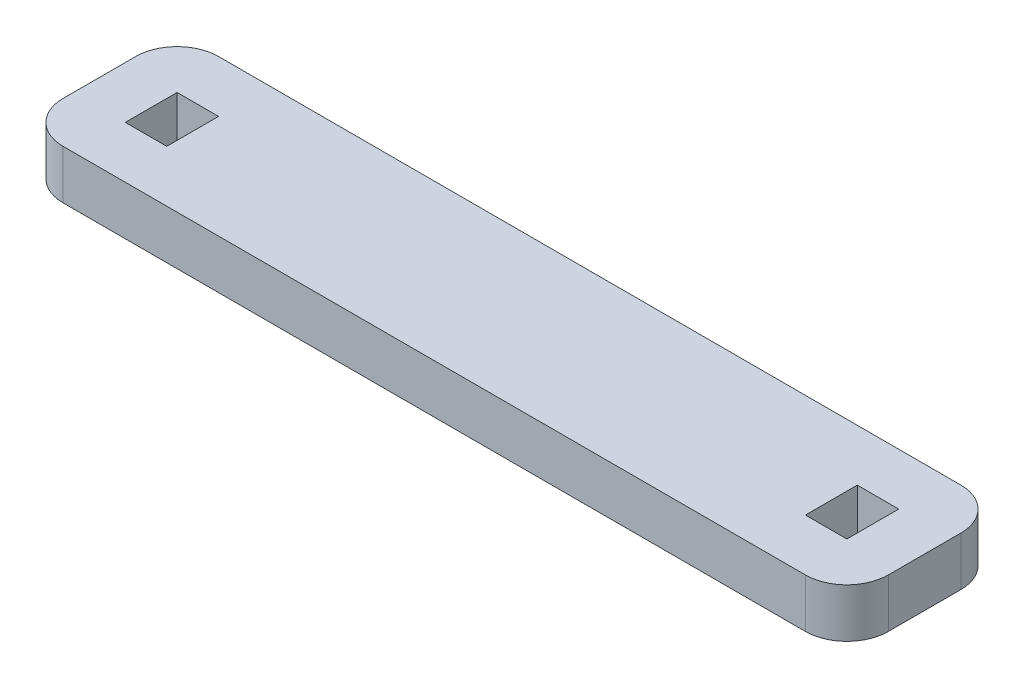
ISO-10303-21;
HEADER;
FILE_DESCRIPTION(('STEP AP214'),'2;1');
FILE_NAME('part.step','',(''),(''),'','','');
FILE_SCHEMA(('AUTOMOTIVE_DESIGN { 1 0 10303 214 1 1 1 1 }'));
ENDSEC;
DATA;
#1=APPLICATION_CONTEXT('core data for automotive mechanical design processes');
#2=APPLICATION_PROTOCOL_DEFINITION('international standard','automotive_design',2000,#1);
#3=PRODUCT_CONTEXT('',#1,'mechanical');
#4=PRODUCT('Part','Part','',(#3));
#5=PRODUCT_RELATED_PRODUCT_CATEGORY('part','',(#4));
#6=PRODUCT_DEFINITION_FORMATION('','',#4);
#7=PRODUCT_DEFINITION_CONTEXT('part definition',#1,'design');
#8=PRODUCT_DEFINITION('design','',#6,#7);
#9=PRODUCT_DEFINITION_SHAPE('','',#8);
#10=(LENGTH_UNIT() NAMED_UNIT(*) SI_UNIT(.MILLI.,.METRE.));
#11=(NAMED_UNIT(*) PLANE_ANGLE_UNIT() SI_UNIT($,.RADIAN.));
#12=(NAMED_UNIT(*) SI_UNIT($,.STERADIAN.) SOLID_ANGLE_UNIT());
#13=UNCERTAINTY_MEASURE_WITH_UNIT(LENGTH_MEASURE(1.E-05),#10,'distance_accuracy_value','');
#14=(GEOMETRIC_REPRESENTATION_CONTEXT(3) GLOBAL_UNCERTAINTY_ASSIGNED_CONTEXT((#13)) GLOBAL_UNIT_ASSIGNED_CONTEXT((#10,
#11,#12)) REPRESENTATION_CONTEXT('',''));
#15=CARTESIAN_POINT('',(0.,0.,0.));
#16=DIRECTION('',(0.,0.,1.));
#17=DIRECTION('',(1.,0.,0.));
#18=AXIS2_PLACEMENT_3D('',#15,#16,#17);
#19=CARTESIAN_POINT('',(0.,1.5,0.));
#20=DIRECTION('',(0.,1.,0.));
#21=DIRECTION('',(0.,0.,1.));
#22=AXIS2_PLACEMENT_3D('',#19,#20,#21);
#23=PLANE('',#22);
#24=DIRECTION('',(-1.,0.,0.));
#25=VECTOR('',#24,1.);
#26=CARTESIAN_POINT('',(25.273,1.5,-4.7625));
#27=LINE('',#26,#25);
#28=CARTESIAN_POINT('',(22.733,1.5,-4.7625));
#29=VERTEX_POINT('',#28);
#30=CARTESIAN_POINT('',(-22.733,1.5,-4.7625));
#31=VERTEX_POINT('',#30);
#32=EDGE_CURVE('E268',#29,#31,#27,.T.);
#33=ORIENTED_EDGE('',*,*,#32,.T.);
#34=CARTESIAN_POINT('',(-22.733,1.5,-2.2225));
#35=DIRECTION('',(0.,1.,0.));
#36=DIRECTION('',(0.,0.,1.));
#37=AXIS2_PLACEMENT_3D('',#34,#35,#36);
#38=CIRCLE('',#37,2.54);
#39=CARTESIAN_POINT('',(-25.273,1.5,-2.2225));
#40=VERTEX_POINT('',#39);
#41=EDGE_CURVE('E319',#31,#40,#38,.T.);
#42=ORIENTED_EDGE('',*,*,#41,.T.);
#43=DIRECTION('',(0.,0.,1.));
#44=VECTOR('',#43,1.);
#45=CARTESIAN_POINT('',(-25.273,1.5,4.7625));
#46=LINE('',#45,#44);
#47=CARTESIAN_POINT('',(-25.273,1.5,2.2225));
#48=VERTEX_POINT('',#47);
#49=EDGE_CURVE('E257',#40,#48,#46,.T.);
#50=ORIENTED_EDGE('',*,*,#49,.T.);
#51=CARTESIAN_POINT('',(-22.733,1.5,2.2225));
#52=DIRECTION('',(0.,1.,0.));
#53=DIRECTION('',(0.,0.,1.));
#54=AXIS2_PLACEMENT_3D('',#51,#52,#53);
#55=CIRCLE('',#54,2.54);
#56=CARTESIAN_POINT('',(-22.733,1.5,4.7625));
#57=VERTEX_POINT('',#56);
#58=EDGE_CURVE('E311',#48,#57,#55,.T.);
#59=ORIENTED_EDGE('',*,*,#58,.T.);
#60=DIRECTION('',(1.,0.,0.));
#61=VECTOR('',#60,1.);
#62=CARTESIAN_POINT('',(25.273,1.5,4.7625));
#63=LINE('',#62,#61);
#64=CARTESIAN_POINT('',(22.733,1.5,4.7625));
#65=VERTEX_POINT('',#64);
#66=EDGE_CURVE('E261',#57,#65,#63,.T.);
#67=ORIENTED_EDGE('',*,*,#66,.T.);
#68=CARTESIAN_POINT('',(22.733,1.5,2.2225));
#69=DIRECTION('',(0.,1.,0.));
#70=DIRECTION('',(0.,0.,1.));
#71=AXIS2_PLACEMENT_3D('',#68,#69,#70);
#72=CIRCLE('',#71,2.54);
#73=CARTESIAN_POINT('',(25.273,1.5,2.2225));
#74=VERTEX_POINT('',#73);
#75=EDGE_CURVE('E68',#65,#74,#72,.T.);
#76=ORIENTED_EDGE('',*,*,#75,.T.);
#77=DIRECTION('',(0.,0.,-1.));
#78=VECTOR('',#77,1.);
#79=CARTESIAN_POINT('',(25.273,1.5,4.7625));
#80=LINE('',#79,#78);
#81=CARTESIAN_POINT('',(25.273,1.5,-2.2225));
#82=VERTEX_POINT('',#81);
#83=EDGE_CURVE('E265',#74,#82,#80,.T.);
#84=ORIENTED_EDGE('',*,*,#83,.T.);
#85=CARTESIAN_POINT('',(22.733,1.5,-2.2225));
#86=DIRECTION('',(0.,1.,0.));
#87=DIRECTION('',(0.,0.,1.));
#88=AXIS2_PLACEMENT_3D('',#85,#86,#87);
#89=CIRCLE('',#88,2.54);
#90=EDGE_CURVE('E316',#82,#29,#89,.T.);
#91=ORIENTED_EDGE('',*,*,#90,.T.);
#92=EDGE_LOOP('',(#33,#42,#50,#59,#67,#76,#84,#91));
#93=FACE_BOUND('',#92,.T.);
#94=DIRECTION('',(1.,0.,0.));
#95=VECTOR('',#94,1.);
#96=CARTESIAN_POINT('',(-19.558,1.5,1.5875));
#97=LINE('',#96,#95);
#98=CARTESIAN_POINT('',(-22.098,1.5,1.5875));
#99=VERTEX_POINT('',#98);
#100=CARTESIAN_POINT('',(-19.558,1.5,1.5875));
#101=VERTEX_POINT('',#100);
#102=EDGE_CURVE('E217',#99,#101,#97,.T.);
#103=ORIENTED_EDGE('',*,*,#102,.F.);
#104=DIRECTION('',(0.,0.,1.));
#105=VECTOR('',#104,1.);
#106=CARTESIAN_POINT('',(-22.098,1.5,1.5875));
#107=LINE('',#106,#105);
#108=CARTESIAN_POINT('',(-22.098,1.5,-1.5875));
#109=VERTEX_POINT('',#108);
#110=EDGE_CURVE('E214',#109,#99,#107,.T.);
#111=ORIENTED_EDGE('',*,*,#110,.F.);
#112=DIRECTION('',(-1.,0.,0.));
#113=VECTOR('',#112,1.);
#114=CARTESIAN_POINT('',(-19.558,1.5,-1.5875));
#115=LINE('',#114,#113);
#116=CARTESIAN_POINT('',(-19.558,1.5,-1.5875));
#117=VERTEX_POINT('',#116);
#118=EDGE_CURVE('E225',#117,#109,#115,.T.);
#119=ORIENTED_EDGE('',*,*,#118,.F.);
#120=DIRECTION('',(0.,0.,-1.));
#121=VECTOR('',#120,1.);
#122=CARTESIAN_POINT('',(-19.558,1.5,1.5875));
#123=LINE('',#122,#121);
#124=EDGE_CURVE('E221',#101,#117,#123,.T.);
#125=ORIENTED_EDGE('',*,*,#124,.F.);
#126=EDGE_LOOP('',(#103,#111,#119,#125));
#127=FACE_BOUND('',#126,.T.);
#128=DIRECTION('',(1.,0.,0.));
#129=VECTOR('',#128,1.);
#130=CARTESIAN_POINT('',(22.098,1.5,1.5875));
#131=LINE('',#130,#129);
#132=CARTESIAN_POINT('',(19.558,1.5,1.5875));
#133=VERTEX_POINT('',#132);
#134=CARTESIAN_POINT('',(22.098,1.5,1.5875));
#135=VERTEX_POINT('',#134);
#136=EDGE_CURVE('E172',#133,#135,#131,.T.);
#137=ORIENTED_EDGE('',*,*,#136,.F.);
#138=DIRECTION('',(0.,0.,1.));
#139=VECTOR('',#138,1.);
#140=CARTESIAN_POINT('',(19.558,1.5,1.5875));
#141=LINE('',#140,#139);
#142=CARTESIAN_POINT('',(19.558,1.5,-1.5875));
#143=VERTEX_POINT('',#142);
#144=EDGE_CURVE('E161',#143,#133,#141,.T.);
#145=ORIENTED_EDGE('',*,*,#144,.F.);
#146=DIRECTION('',(-1.,0.,0.));
#147=VECTOR('',#146,1.);
#148=CARTESIAN_POINT('',(22.098,1.5,-1.5875));
#149=LINE('',#148,#147);
#150=CARTESIAN_POINT('',(22.098,1.5,-1.5875));
#151=VERTEX_POINT('',#150);
#152=EDGE_CURVE('E190',#151,#143,#149,.T.);
#153=ORIENTED_EDGE('',*,*,#152,.F.);
#154=DIRECTION('',(0.,0.,-1.));
#155=VECTOR('',#154,1.);
#156=CARTESIAN_POINT('',(22.098,1.5,1.5875));
#157=LINE('',#156,#155);
#158=EDGE_CURVE('E186',#135,#151,#157,.T.);
#159=ORIENTED_EDGE('',*,*,#158,.F.);
#160=EDGE_LOOP('',(#137,#145,#153,#159));
#161=FACE_BOUND('',#160,.T.);
#162=ADVANCED_FACE('F45',(#93,#127,#161),#23,.T.);
#163=CARTESIAN_POINT('',(0.,-1.5,0.));
#164=DIRECTION('',(0.,1.,0.));
#165=DIRECTION('',(0.,0.,1.));
#166=AXIS2_PLACEMENT_3D('',#163,#164,#165);
#167=PLANE('',#166);
#168=DIRECTION('',(0.,0.,1.));
#169=VECTOR('',#168,1.);
#170=CARTESIAN_POINT('',(-22.098,-1.5,1.5875));
#171=LINE('',#170,#169);
#172=CARTESIAN_POINT('',(-22.098,-1.5,-1.5875));
#173=VERTEX_POINT('',#172);
#174=CARTESIAN_POINT('',(-22.098,-1.5,1.5875));
#175=VERTEX_POINT('',#174);
#176=EDGE_CURVE('E181',#173,#175,#171,.T.);
#177=ORIENTED_EDGE('',*,*,#176,.T.);
#178=DIRECTION('',(1.,0.,0.));
#179=VECTOR('',#178,1.);
#180=CARTESIAN_POINT('',(-19.558,-1.5,1.5875));
#181=LINE('',#180,#179);
#182=CARTESIAN_POINT('',(-19.558,-1.5,1.5875));
#183=VERTEX_POINT('',#182);
#184=EDGE_CURVE('E232',#175,#183,#181,.T.);
#185=ORIENTED_EDGE('',*,*,#184,.T.);
#186=DIRECTION('',(0.,0.,-1.));
#187=VECTOR('',#186,1.);
#188=CARTESIAN_POINT('',(-19.558,-1.5,1.5875));
#189=LINE('',#188,#187);
#190=CARTESIAN_POINT('',(-19.558,-1.5,-1.5875));
#191=VERTEX_POINT('',#190);
#192=EDGE_CURVE('E236',#183,#191,#189,.T.);
#193=ORIENTED_EDGE('',*,*,#192,.T.);
#194=DIRECTION('',(-1.,0.,0.));
#195=VECTOR('',#194,1.);
#196=CARTESIAN_POINT('',(-19.558,-1.5,-1.5875));
#197=LINE('',#196,#195);
#198=EDGE_CURVE('E218',#191,#173,#197,.T.);
#199=ORIENTED_EDGE('',*,*,#198,.T.);
#200=EDGE_LOOP('',(#177,#185,#193,#199));
#201=FACE_BOUND('',#200,.T.);
#202=DIRECTION('',(0.,0.,1.));
#203=VECTOR('',#202,1.);
#204=CARTESIAN_POINT('',(-25.273,-1.5,4.7625));
#205=LINE('',#204,#203);
#206=CARTESIAN_POINT('',(-25.273,-1.5,-2.2225));
#207=VERTEX_POINT('',#206);
#208=CARTESIAN_POINT('',(-25.273,-1.5,2.2225));
#209=VERTEX_POINT('',#208);
#210=EDGE_CURVE('E256',#207,#209,#205,.T.);
#211=ORIENTED_EDGE('',*,*,#210,.F.);
#212=CARTESIAN_POINT('',(-22.733,-1.5,-2.2225));
#213=DIRECTION('',(0.,1.,0.));
#214=DIRECTION('',(0.,0.,1.));
#215=AXIS2_PLACEMENT_3D('',#212,#213,#214);
#216=CIRCLE('',#215,2.54);
#217=CARTESIAN_POINT('',(-22.733,-1.5,-4.7625));
#218=VERTEX_POINT('',#217);
#219=EDGE_CURVE('E301',#207,#218,#216,.F.);
#220=ORIENTED_EDGE('',*,*,#219,.T.);
#221=DIRECTION('',(-1.,0.,0.));
#222=VECTOR('',#221,1.);
#223=CARTESIAN_POINT('',(25.273,-1.5,-4.7625));
#224=LINE('',#223,#222);
#225=CARTESIAN_POINT('',(22.733,-1.5,-4.7625));
#226=VERTEX_POINT('',#225);
#227=EDGE_CURVE('E262',#226,#218,#224,.T.);
#228=ORIENTED_EDGE('',*,*,#227,.F.);
#229=CARTESIAN_POINT('',(22.733,-1.5,-2.2225));
#230=DIRECTION('',(0.,1.,0.));
#231=DIRECTION('',(0.,0.,1.));
#232=AXIS2_PLACEMENT_3D('',#229,#230,#231);
#233=CIRCLE('',#232,2.54);
#234=CARTESIAN_POINT('',(25.273,-1.5,-2.2225));
#235=VERTEX_POINT('',#234);
#236=EDGE_CURVE('E298',#226,#235,#233,.F.);
#237=ORIENTED_EDGE('',*,*,#236,.T.);
#238=DIRECTION('',(0.,0.,-1.));
#239=VECTOR('',#238,1.);
#240=CARTESIAN_POINT('',(25.273,-1.5,4.7625));
#241=LINE('',#240,#239);
#242=CARTESIAN_POINT('',(25.273,-1.5,2.2225));
#243=VERTEX_POINT('',#242);
#244=EDGE_CURVE('E280',#243,#235,#241,.T.);
#245=ORIENTED_EDGE('',*,*,#244,.F.);
#246=CARTESIAN_POINT('',(22.733,-1.5,2.2225));
#247=DIRECTION('',(0.,1.,0.));
#248=DIRECTION('',(0.,0.,1.));
#249=AXIS2_PLACEMENT_3D('',#246,#247,#248);
#250=CIRCLE('',#249,2.54);
#251=CARTESIAN_POINT('',(22.733,-1.5,4.7625));
#252=VERTEX_POINT('',#251);
#253=EDGE_CURVE('E295',#243,#252,#250,.F.);
#254=ORIENTED_EDGE('',*,*,#253,.T.);
#255=DIRECTION('',(1.,0.,0.));
#256=VECTOR('',#255,1.);
#257=CARTESIAN_POINT('',(25.273,-1.5,4.7625));
#258=LINE('',#257,#256);
#259=CARTESIAN_POINT('',(-22.733,-1.5,4.7625));
#260=VERTEX_POINT('',#259);
#261=EDGE_CURVE('E276',#260,#252,#258,.T.);
#262=ORIENTED_EDGE('',*,*,#261,.F.);
#263=CARTESIAN_POINT('',(-22.733,-1.5,2.2225));
#264=DIRECTION('',(0.,1.,0.));
#265=DIRECTION('',(0.,0.,1.));
#266=AXIS2_PLACEMENT_3D('',#263,#264,#265);
#267=CIRCLE('',#266,2.54);
#268=EDGE_CURVE('E292',#260,#209,#267,.F.);
#269=ORIENTED_EDGE('',*,*,#268,.T.);
#270=EDGE_LOOP('',(#211,#220,#228,#237,#245,#254,#262,#269));
#271=FACE_BOUND('',#270,.T.);
#272=DIRECTION('',(0.,0.,1.));
#273=VECTOR('',#272,1.);
#274=CARTESIAN_POINT('',(19.558,-1.5,1.5875));
#275=LINE('',#274,#273);
#276=CARTESIAN_POINT('',(19.558,-1.5,-1.5875));
#277=VERTEX_POINT('',#276);
#278=CARTESIAN_POINT('',(19.558,-1.5,1.5875));
#279=VERTEX_POINT('',#278);
#280=EDGE_CURVE('E195',#277,#279,#275,.T.);
#281=ORIENTED_EDGE('',*,*,#280,.T.);
#282=DIRECTION('',(1.,0.,0.));
#283=VECTOR('',#282,1.);
#284=CARTESIAN_POINT('',(22.098,-1.5,1.5875));
#285=LINE('',#284,#283);
#286=CARTESIAN_POINT('',(22.098,-1.5,1.5875));
#287=VERTEX_POINT('',#286);
#288=EDGE_CURVE('E179',#279,#287,#285,.T.);
#289=ORIENTED_EDGE('',*,*,#288,.T.);
#290=DIRECTION('',(0.,0.,-1.));
#291=VECTOR('',#290,1.);
#292=CARTESIAN_POINT('',(22.098,-1.5,1.5875));
#293=LINE('',#292,#291);
#294=CARTESIAN_POINT('',(22.098,-1.5,-1.5875));
#295=VERTEX_POINT('',#294);
#296=EDGE_CURVE('E200',#287,#295,#293,.T.);
#297=ORIENTED_EDGE('',*,*,#296,.T.);
#298=DIRECTION('',(-1.,0.,0.));
#299=VECTOR('',#298,1.);
#300=CARTESIAN_POINT('',(22.098,-1.5,-1.5875));
#301=LINE('',#300,#299);
#302=EDGE_CURVE('E173',#295,#277,#301,.T.);
#303=ORIENTED_EDGE('',*,*,#302,.T.);
#304=EDGE_LOOP('',(#281,#289,#297,#303));
#305=FACE_BOUND('',#304,.T.);
#306=ADVANCED_FACE('F339',(#201,#271,#305),#167,.F.);
#307=CARTESIAN_POINT('',(-25.273,1.5,4.7625));
#308=DIRECTION('',(1.,0.,0.));
#309=DIRECTION('',(0.,0.,-1.));
#310=AXIS2_PLACEMENT_3D('',#307,#308,#309);
#311=PLANE('',#310);
#312=ORIENTED_EDGE('',*,*,#49,.F.);
#313=DIRECTION('',(0.,-1.,0.));
#314=VECTOR('',#313,1.);
#315=CARTESIAN_POINT('',(-25.273,1.5,-2.2225));
#316=LINE('',#315,#314);
#317=EDGE_CURVE('E288',#40,#207,#316,.T.);
#318=ORIENTED_EDGE('',*,*,#317,.T.);
#319=ORIENTED_EDGE('',*,*,#210,.T.);
#320=DIRECTION('',(0.,-1.,0.));
#321=VECTOR('',#320,1.);
#322=CARTESIAN_POINT('',(-25.273,1.5,2.2225));
#323=LINE('',#322,#321);
#324=EDGE_CURVE('E272',#209,#48,#323,.F.);
#325=ORIENTED_EDGE('',*,*,#324,.T.);
#326=EDGE_LOOP('',(#312,#318,#319,#325));
#327=FACE_BOUND('',#326,.T.);
#328=ADVANCED_FACE('F362',(#327),#311,.F.);
#329=CARTESIAN_POINT('',(25.273,1.5,4.7625));
#330=DIRECTION('',(0.,0.,-1.));
#331=DIRECTION('',(-1.,0.,0.));
#332=AXIS2_PLACEMENT_3D('',#329,#330,#331);
#333=PLANE('',#332);
#334=ORIENTED_EDGE('',*,*,#261,.T.);
#335=DIRECTION('',(0.,-1.,0.));
#336=VECTOR('',#335,1.);
#337=CARTESIAN_POINT('',(22.733,1.5,4.7625));
#338=LINE('',#337,#336);
#339=EDGE_CURVE('E11',#252,#65,#338,.F.);
#340=ORIENTED_EDGE('',*,*,#339,.T.);
#341=ORIENTED_EDGE('',*,*,#66,.F.);
#342=DIRECTION('',(0.,-1.,0.));
#343=VECTOR('',#342,1.);
#344=CARTESIAN_POINT('',(-22.733,1.5,4.7625));
#345=LINE('',#344,#343);
#346=EDGE_CURVE('E54',#57,#260,#345,.T.);
#347=ORIENTED_EDGE('',*,*,#346,.T.);
#348=EDGE_LOOP('',(#334,#340,#341,#347));
#349=FACE_BOUND('',#348,.T.);
#350=ADVANCED_FACE('F333',(#349),#333,.F.);
#351=CARTESIAN_POINT('',(25.273,1.5,4.7625));
#352=DIRECTION('',(-1.,0.,0.));
#353=DIRECTION('',(0.,0.,1.));
#354=AXIS2_PLACEMENT_3D('',#351,#352,#353);
#355=PLANE('',#354);
#356=ORIENTED_EDGE('',*,*,#244,.T.);
#357=DIRECTION('',(0.,-1.,0.));
#358=VECTOR('',#357,1.);
#359=CARTESIAN_POINT('',(25.273,1.5,-2.2225));
#360=LINE('',#359,#358);
#361=EDGE_CURVE('E61',#235,#82,#360,.F.);
#362=ORIENTED_EDGE('',*,*,#361,.T.);
#363=ORIENTED_EDGE('',*,*,#83,.F.);
#364=DIRECTION('',(0.,-1.,0.));
#365=VECTOR('',#364,1.);
#366=CARTESIAN_POINT('',(25.273,1.5,2.2225));
#367=LINE('',#366,#365);
#368=EDGE_CURVE('E322',#74,#243,#367,.T.);
#369=ORIENTED_EDGE('',*,*,#368,.T.);
#370=EDGE_LOOP('',(#356,#362,#363,#369));
#371=FACE_BOUND('',#370,.T.);
#372=ADVANCED_FACE('F345',(#371),#355,.F.);
#373=CARTESIAN_POINT('',(25.273,1.5,-4.7625));
#374=DIRECTION('',(0.,0.,1.));
#375=DIRECTION('',(1.,0.,0.));
#376=AXIS2_PLACEMENT_3D('',#373,#374,#375);
#377=PLANE('',#376);
#378=ORIENTED_EDGE('',*,*,#227,.T.);
#379=DIRECTION('',(0.,-1.,0.));
#380=VECTOR('',#379,1.);
#381=CARTESIAN_POINT('',(-22.733,1.5,-4.7625));
#382=LINE('',#381,#380);
#383=EDGE_CURVE('E308',#218,#31,#382,.F.);
#384=ORIENTED_EDGE('',*,*,#383,.T.);
#385=ORIENTED_EDGE('',*,*,#32,.F.);
#386=DIRECTION('',(0.,-1.,0.));
#387=VECTOR('',#386,1.);
#388=CARTESIAN_POINT('',(22.733,1.5,-4.7625));
#389=LINE('',#388,#387);
#390=EDGE_CURVE('E304',#29,#226,#389,.T.);
#391=ORIENTED_EDGE('',*,*,#390,.T.);
#392=EDGE_LOOP('',(#378,#384,#385,#391));
#393=FACE_BOUND('',#392,.T.);
#394=ADVANCED_FACE('F354',(#393),#377,.F.);
#395=CARTESIAN_POINT('',(-22.098,1.5,1.5875));
#396=DIRECTION('',(1.,0.,0.));
#397=DIRECTION('',(0.,0.,-1.));
#398=AXIS2_PLACEMENT_3D('',#395,#396,#397);
#399=PLANE('',#398);
#400=ORIENTED_EDGE('',*,*,#176,.F.);
#401=DIRECTION('',(0.,-1.,0.));
#402=VECTOR('',#401,1.);
#403=CARTESIAN_POINT('',(-22.098,1.5,-1.5875));
#404=LINE('',#403,#402);
#405=EDGE_CURVE('E228',#109,#173,#404,.T.);
#406=ORIENTED_EDGE('',*,*,#405,.F.);
#407=ORIENTED_EDGE('',*,*,#110,.T.);
#408=DIRECTION('',(0.,-1.,0.));
#409=VECTOR('',#408,1.);
#410=CARTESIAN_POINT('',(-22.098,1.5,1.5875));
#411=LINE('',#410,#409);
#412=EDGE_CURVE('E252',#99,#175,#411,.T.);
#413=ORIENTED_EDGE('',*,*,#412,.T.);
#414=EDGE_LOOP('',(#400,#406,#407,#413));
#415=FACE_BOUND('',#414,.T.);
#416=ADVANCED_FACE('F377',(#415),#399,.T.);
#417=CARTESIAN_POINT('',(-19.558,1.5,1.5875));
#418=DIRECTION('',(0.,0.,-1.));
#419=DIRECTION('',(-1.,0.,0.));
#420=AXIS2_PLACEMENT_3D('',#417,#418,#419);
#421=PLANE('',#420);
#422=ORIENTED_EDGE('',*,*,#184,.F.);
#423=ORIENTED_EDGE('',*,*,#412,.F.);
#424=ORIENTED_EDGE('',*,*,#102,.T.);
#425=DIRECTION('',(0.,-1.,0.));
#426=VECTOR('',#425,1.);
#427=CARTESIAN_POINT('',(-19.558,1.5,1.5875));
#428=LINE('',#427,#426);
#429=EDGE_CURVE('E249',#101,#183,#428,.T.);
#430=ORIENTED_EDGE('',*,*,#429,.T.);
#431=EDGE_LOOP('',(#422,#423,#424,#430));
#432=FACE_BOUND('',#431,.T.);
#433=ADVANCED_FACE('F459',(#432),#421,.T.);
#434=CARTESIAN_POINT('',(-19.558,1.5,1.5875));
#435=DIRECTION('',(-1.,0.,0.));
#436=DIRECTION('',(0.,0.,1.));
#437=AXIS2_PLACEMENT_3D('',#434,#435,#436);
#438=PLANE('',#437);
#439=ORIENTED_EDGE('',*,*,#192,.F.);
#440=ORIENTED_EDGE('',*,*,#429,.F.);
#441=ORIENTED_EDGE('',*,*,#124,.T.);
#442=DIRECTION('',(0.,-1.,0.));
#443=VECTOR('',#442,1.);
#444=CARTESIAN_POINT('',(-19.558,1.5,-1.5875));
#445=LINE('',#444,#443);
#446=EDGE_CURVE('E246',#117,#191,#445,.T.);
#447=ORIENTED_EDGE('',*,*,#446,.T.);
#448=EDGE_LOOP('',(#439,#440,#441,#447));
#449=FACE_BOUND('',#448,.T.);
#450=ADVANCED_FACE('F450',(#449),#438,.T.);
#451=CARTESIAN_POINT('',(-19.558,1.5,-1.5875));
#452=DIRECTION('',(0.,0.,1.));
#453=DIRECTION('',(1.,0.,0.));
#454=AXIS2_PLACEMENT_3D('',#451,#452,#453);
#455=PLANE('',#454);
#456=ORIENTED_EDGE('',*,*,#198,.F.);
#457=ORIENTED_EDGE('',*,*,#446,.F.);
#458=ORIENTED_EDGE('',*,*,#118,.T.);
#459=ORIENTED_EDGE('',*,*,#405,.T.);
#460=EDGE_LOOP('',(#456,#457,#458,#459));
#461=FACE_BOUND('',#460,.T.);
#462=ADVANCED_FACE('F442',(#461),#455,.T.);
#463=CARTESIAN_POINT('',(19.558,1.5,1.5875));
#464=DIRECTION('',(1.,0.,0.));
#465=DIRECTION('',(0.,0.,-1.));
#466=AXIS2_PLACEMENT_3D('',#463,#464,#465);
#467=PLANE('',#466);
#468=ORIENTED_EDGE('',*,*,#280,.F.);
#469=DIRECTION('',(0.,-1.,0.));
#470=VECTOR('',#469,1.);
#471=CARTESIAN_POINT('',(19.558,1.5,-1.5875));
#472=LINE('',#471,#470);
#473=EDGE_CURVE('E167',#143,#277,#472,.T.);
#474=ORIENTED_EDGE('',*,*,#473,.F.);
#475=ORIENTED_EDGE('',*,*,#144,.T.);
#476=DIRECTION('',(0.,-1.,0.));
#477=VECTOR('',#476,1.);
#478=CARTESIAN_POINT('',(19.558,1.5,1.5875));
#479=LINE('',#478,#477);
#480=EDGE_CURVE('E164',#133,#279,#479,.T.);
#481=ORIENTED_EDGE('',*,*,#480,.T.);
#482=EDGE_LOOP('',(#468,#474,#475,#481));
#483=FACE_BOUND('',#482,.T.);
#484=ADVANCED_FACE('F163',(#483),#467,.T.);
#485=CARTESIAN_POINT('',(22.098,1.5,1.5875));
#486=DIRECTION('',(0.,0.,-1.));
#487=DIRECTION('',(-1.,0.,0.));
#488=AXIS2_PLACEMENT_3D('',#485,#486,#487);
#489=PLANE('',#488);
#490=ORIENTED_EDGE('',*,*,#288,.F.);
#491=ORIENTED_EDGE('',*,*,#480,.F.);
#492=ORIENTED_EDGE('',*,*,#136,.T.);
#493=DIRECTION('',(0.,-1.,0.));
#494=VECTOR('',#493,1.);
#495=CARTESIAN_POINT('',(22.098,1.5,1.5875));
#496=LINE('',#495,#494);
#497=EDGE_CURVE('E182',#135,#287,#496,.T.);
#498=ORIENTED_EDGE('',*,*,#497,.T.);
#499=EDGE_LOOP('',(#490,#491,#492,#498));
#500=FACE_BOUND('',#499,.T.);
#501=ADVANCED_FACE('F176',(#500),#489,.T.);
#502=CARTESIAN_POINT('',(22.098,1.5,1.5875));
#503=DIRECTION('',(-1.,0.,0.));
#504=DIRECTION('',(0.,0.,1.));
#505=AXIS2_PLACEMENT_3D('',#502,#503,#504);
#506=PLANE('',#505);
#507=ORIENTED_EDGE('',*,*,#296,.F.);
#508=ORIENTED_EDGE('',*,*,#497,.F.);
#509=ORIENTED_EDGE('',*,*,#158,.T.);
#510=DIRECTION('',(0.,-1.,0.));
#511=VECTOR('',#510,1.);
#512=CARTESIAN_POINT('',(22.098,1.5,-1.5875));
#513=LINE('',#512,#511);
#514=EDGE_CURVE('E209',#151,#295,#513,.T.);
#515=ORIENTED_EDGE('',*,*,#514,.T.);
#516=EDGE_LOOP('',(#507,#508,#509,#515));
#517=FACE_BOUND('',#516,.T.);
#518=ADVANCED_FACE('F418',(#517),#506,.T.);
#519=CARTESIAN_POINT('',(22.098,1.5,-1.5875));
#520=DIRECTION('',(0.,0.,1.));
#521=DIRECTION('',(1.,0.,0.));
#522=AXIS2_PLACEMENT_3D('',#519,#520,#521);
#523=PLANE('',#522);
#524=ORIENTED_EDGE('',*,*,#302,.F.);
#525=ORIENTED_EDGE('',*,*,#514,.F.);
#526=ORIENTED_EDGE('',*,*,#152,.T.);
#527=ORIENTED_EDGE('',*,*,#473,.T.);
#528=EDGE_LOOP('',(#524,#525,#526,#527));
#529=FACE_BOUND('',#528,.T.);
#530=ADVANCED_FACE('F390',(#529),#523,.T.);
#531=CARTESIAN_POINT('',(-22.733,1.5,-2.2225));
#532=DIRECTION('',(0.,-1.,0.));
#533=DIRECTION('',(0.,0.,-1.));
#534=AXIS2_PLACEMENT_3D('',#531,#532,#533);
#535=CYLINDRICAL_SURFACE('',#534,2.54);
#536=ORIENTED_EDGE('',*,*,#41,.F.);
#537=ORIENTED_EDGE('',*,*,#383,.F.);
#538=ORIENTED_EDGE('',*,*,#219,.F.);
#539=ORIENTED_EDGE('',*,*,#317,.F.);
#540=EDGE_LOOP('',(#536,#537,#538,#539));
#541=FACE_BOUND('',#540,.T.);
#542=ADVANCED_FACE('F359',(#541),#535,.T.);
#543=CARTESIAN_POINT('',(22.733,1.5,-2.2225));
#544=DIRECTION('',(0.,-1.,0.));
#545=DIRECTION('',(0.,0.,-1.));
#546=AXIS2_PLACEMENT_3D('',#543,#544,#545);
#547=CYLINDRICAL_SURFACE('',#546,2.54);
#548=ORIENTED_EDGE('',*,*,#90,.F.);
#549=ORIENTED_EDGE('',*,*,#361,.F.);
#550=ORIENTED_EDGE('',*,*,#236,.F.);
#551=ORIENTED_EDGE('',*,*,#390,.F.);
#552=EDGE_LOOP('',(#548,#549,#550,#551));
#553=FACE_BOUND('',#552,.T.);
#554=ADVANCED_FACE('F351',(#553),#547,.T.);
#555=CARTESIAN_POINT('',(22.733,1.5,2.2225));
#556=DIRECTION('',(0.,-1.,0.));
#557=DIRECTION('',(0.,0.,-1.));
#558=AXIS2_PLACEMENT_3D('',#555,#556,#557);
#559=CYLINDRICAL_SURFACE('',#558,2.54);
#560=ORIENTED_EDGE('',*,*,#75,.F.);
#561=ORIENTED_EDGE('',*,*,#339,.F.);
#562=ORIENTED_EDGE('',*,*,#253,.F.);
#563=ORIENTED_EDGE('',*,*,#368,.F.);
#564=EDGE_LOOP('',(#560,#561,#562,#563));
#565=FACE_BOUND('',#564,.T.);
#566=ADVANCED_FACE('F344',(#565),#559,.T.);
#567=CARTESIAN_POINT('',(-22.733,1.5,2.2225));
#568=DIRECTION('',(0.,-1.,0.));
#569=DIRECTION('',(0.,0.,-1.));
#570=AXIS2_PLACEMENT_3D('',#567,#568,#569);
#571=CYLINDRICAL_SURFACE('',#570,2.54);
#572=ORIENTED_EDGE('',*,*,#58,.F.);
#573=ORIENTED_EDGE('',*,*,#324,.F.);
#574=ORIENTED_EDGE('',*,*,#268,.F.);
#575=ORIENTED_EDGE('',*,*,#346,.F.);
#576=EDGE_LOOP('',(#572,#573,#574,#575));
#577=FACE_BOUND('',#576,.T.);
#578=ADVANCED_FACE('F47',(#577),#571,.T.);
#579=CLOSED_SHELL('',(#162,#306,#328,#350,#372,#394,#416,#433,#450,#462,#484,#501,#518,#530,
#542,#554,#566,#578));
#580=MANIFOLD_SOLID_BREP('B2',#579);
#581=ADVANCED_BREP_SHAPE_REPRESENTATION('',(#18,#580),#14);
#582=SHAPE_DEFINITION_REPRESENTATION(#9,#581);
ENDSEC;
END-ISO-10303-21;
